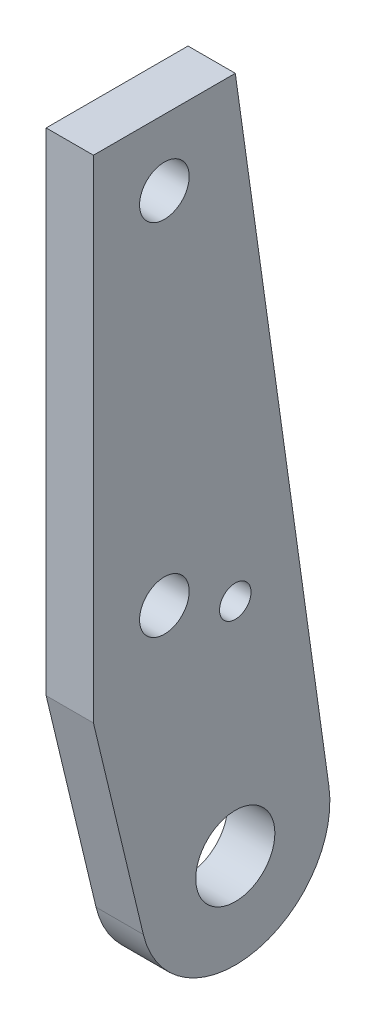
ISO-10303-21;
HEADER;
FILE_DESCRIPTION(('STEP AP214'),'2;1');
FILE_NAME('part.step','',(''),(''),'','','');
FILE_SCHEMA(('AUTOMOTIVE_DESIGN { 1 0 10303 214 1 1 1 1 }'));
ENDSEC;
DATA;
#1=APPLICATION_CONTEXT('core data for automotive mechanical design processes');
#2=APPLICATION_PROTOCOL_DEFINITION('international standard','automotive_design',2000,#1);
#3=PRODUCT_CONTEXT('',#1,'mechanical');
#4=PRODUCT('Part','Part','',(#3));
#5=PRODUCT_RELATED_PRODUCT_CATEGORY('part','',(#4));
#6=PRODUCT_DEFINITION_FORMATION('','',#4);
#7=PRODUCT_DEFINITION_CONTEXT('part definition',#1,'design');
#8=PRODUCT_DEFINITION('design','',#6,#7);
#9=PRODUCT_DEFINITION_SHAPE('','',#8);
#10=(LENGTH_UNIT() NAMED_UNIT(*) SI_UNIT(.MILLI.,.METRE.));
#11=(NAMED_UNIT(*) PLANE_ANGLE_UNIT() SI_UNIT($,.RADIAN.));
#12=(NAMED_UNIT(*) SI_UNIT($,.STERADIAN.) SOLID_ANGLE_UNIT());
#13=UNCERTAINTY_MEASURE_WITH_UNIT(LENGTH_MEASURE(1.E-05),#10,'distance_accuracy_value','');
#14=(GEOMETRIC_REPRESENTATION_CONTEXT(3) GLOBAL_UNCERTAINTY_ASSIGNED_CONTEXT((#13)) GLOBAL_UNIT_ASSIGNED_CONTEXT((#10,
#11,#12)) REPRESENTATION_CONTEXT('',''));
#15=CARTESIAN_POINT('',(0.,0.,0.));
#16=DIRECTION('',(0.,0.,1.));
#17=DIRECTION('',(1.,0.,0.));
#18=AXIS2_PLACEMENT_3D('',#15,#16,#17);
#19=CARTESIAN_POINT('',(52.7445119012656,-291545.,7.000000000005));
#20=DIRECTION('',(0.,0.,-1.));
#21=DIRECTION('',(0.,1.,0.));
#22=AXIS2_PLACEMENT_3D('',#19,#20,#21);
#23=PLANE('',#22);
#24=DIRECTION('',(0.,-1.,0.));
#25=VECTOR('',#24,1.);
#26=CARTESIAN_POINT('',(1.5,-291545.,7.000000000005));
#27=LINE('',#26,#25);
#28=CARTESIAN_POINT('',(1.5,24.4999999999891,7.000000000005));
#29=VERTEX_POINT('',#28);
#30=CARTESIAN_POINT('',(1.5,-6.69124999993187,6.99999999994105));
#31=VERTEX_POINT('',#30);
#32=EDGE_CURVE('E102',#29,#31,#27,.T.);
#33=ORIENTED_EDGE('',*,*,#32,.F.);
#34=DIRECTION('',(-1.,0.,0.));
#35=VECTOR('',#34,1.);
#36=CARTESIAN_POINT('',(52.7445119012656,24.4999999999891,7.000000000005));
#37=LINE('',#36,#35);
#38=CARTESIAN_POINT('',(-1.5,24.4999999999891,7.000000000005));
#39=VERTEX_POINT('',#38);
#40=EDGE_CURVE('E37',#29,#39,#37,.T.);
#41=ORIENTED_EDGE('',*,*,#40,.T.);
#42=DIRECTION('',(0.,-1.,0.));
#43=VECTOR('',#42,1.);
#44=CARTESIAN_POINT('',(-1.5,-291545.,7.000000000005));
#45=LINE('',#44,#43);
#46=CARTESIAN_POINT('',(-1.5,-6.69124999993187,6.99999999994105));
#47=VERTEX_POINT('',#46);
#48=EDGE_CURVE('E112',#39,#47,#45,.T.);
#49=ORIENTED_EDGE('',*,*,#48,.T.);
#50=DIRECTION('',(-1.,0.,0.));
#51=VECTOR('',#50,1.);
#52=CARTESIAN_POINT('',(52.7445119012656,-6.69124999993187,6.99999999994105));
#53=LINE('',#52,#51);
#54=EDGE_CURVE('E76',#31,#47,#53,.T.);
#55=ORIENTED_EDGE('',*,*,#54,.F.);
#56=EDGE_LOOP('',(#33,#41,#49,#55));
#57=FACE_BOUND('',#56,.T.);
#58=ADVANCED_FACE('F33',(#57),#23,.F.);
#59=CARTESIAN_POINT('',(52.7445119012656,-185053.778356643,-44341.5232351401));
#60=DIRECTION('',(0.,0.233060998221894,-0.972462118083689));
#61=DIRECTION('',(0.,0.972462118083689,0.233060998221894));
#62=AXIS2_PLACEMENT_3D('',#59,#60,#61);
#63=PLANE('',#62);
#64=DIRECTION('',(0.,-0.972462118083689,-0.233060998221894));
#65=VECTOR('',#64,1.);
#66=CARTESIAN_POINT('',(1.5,-185053.778356643,-44341.5232351401));
#67=LINE('',#66,#65);
#68=CARTESIAN_POINT('',(1.5,-19.8983659892544,3.83477270852562));
#69=VERTEX_POINT('',#68);
#70=EDGE_CURVE('E83',#31,#69,#67,.T.);
#71=ORIENTED_EDGE('',*,*,#70,.F.);
#72=ORIENTED_EDGE('',*,*,#54,.T.);
#73=DIRECTION('',(0.,-0.972462118083689,-0.233060998221894));
#74=VECTOR('',#73,1.);
#75=CARTESIAN_POINT('',(-1.5,-185053.778356643,-44341.5232351401));
#76=LINE('',#75,#74);
#77=CARTESIAN_POINT('',(-1.5,-19.8983659892544,3.83477270852562));
#78=VERTEX_POINT('',#77);
#79=EDGE_CURVE('E111',#47,#78,#76,.T.);
#80=ORIENTED_EDGE('',*,*,#79,.T.);
#81=DIRECTION('',(-1.,0.,0.));
#82=VECTOR('',#81,1.);
#83=CARTESIAN_POINT('',(52.7445119012656,-19.8983659892544,3.83477270852562));
#84=LINE('',#83,#82);
#85=EDGE_CURVE('E113',#69,#78,#84,.T.);
#86=ORIENTED_EDGE('',*,*,#85,.F.);
#87=EDGE_LOOP('',(#71,#72,#80,#86));
#88=FACE_BOUND('',#87,.T.);
#89=ADVANCED_FACE('F174',(#88),#63,.F.);
#90=CARTESIAN_POINT('',(52.7445119012656,-18.4999999999995,-1.99999999999534));
#91=DIRECTION('',(-1.,0.,0.));
#92=DIRECTION('',(0.,0.,1.));
#93=AXIS2_PLACEMENT_3D('',#90,#91,#92);
#94=CYLINDRICAL_SURFACE('',#93,6.00000000000048);
#95=CARTESIAN_POINT('',(1.5,-18.4999999999995,-1.99999999999534));
#96=DIRECTION('',(1.,0.,0.));
#97=DIRECTION('',(0.,0.,-1.));
#98=AXIS2_PLACEMENT_3D('',#95,#96,#97);
#99=CIRCLE('',#98,6.00000000000048);
#100=CARTESIAN_POINT('',(1.5,-17.6627906976705,-7.94130293652273));
#101=VERTEX_POINT('',#100);
#102=EDGE_CURVE('E42',#69,#101,#99,.T.);
#103=ORIENTED_EDGE('',*,*,#102,.F.);
#104=ORIENTED_EDGE('',*,*,#85,.T.);
#105=CARTESIAN_POINT('',(-1.5,-18.4999999999995,-1.99999999999534));
#106=DIRECTION('',(1.,0.,0.));
#107=DIRECTION('',(0.,0.,-1.));
#108=AXIS2_PLACEMENT_3D('',#105,#106,#107);
#109=CIRCLE('',#108,6.00000000000048);
#110=CARTESIAN_POINT('',(-1.5,-17.6627906976705,-7.94130293652273));
#111=VERTEX_POINT('',#110);
#112=EDGE_CURVE('E96',#78,#111,#109,.T.);
#113=ORIENTED_EDGE('',*,*,#112,.T.);
#114=DIRECTION('',(-1.,0.,0.));
#115=VECTOR('',#114,1.);
#116=CARTESIAN_POINT('',(52.7445119012656,-17.6627906976705,-7.94130293652273));
#117=LINE('',#116,#115);
#118=EDGE_CURVE('E88',#101,#111,#117,.T.);
#119=ORIENTED_EDGE('',*,*,#118,.F.);
#120=EDGE_LOOP('',(#103,#104,#113,#119));
#121=FACE_BOUND('',#120,.T.);
#122=ADVANCED_FACE('F94',(#121),#94,.T.);
#123=CARTESIAN_POINT('',(52.7445119012656,-230599.935932356,-32500.0774701305));
#124=DIRECTION('',(0.,-0.139534883720944,0.990217156095057));
#125=DIRECTION('',(0.,-0.990217156095057,-0.139534883720944));
#126=AXIS2_PLACEMENT_3D('',#123,#124,#125);
#127=PLANE('',#126);
#128=DIRECTION('',(0.,0.990217156095057,0.139534883720944));
#129=VECTOR('',#128,1.);
#130=CARTESIAN_POINT('',(1.5,-230599.935932356,-32500.0774701305));
#131=LINE('',#130,#129);
#132=CARTESIAN_POINT('',(1.5,24.4999999999891,-1.99999999995271));
#133=VERTEX_POINT('',#132);
#134=EDGE_CURVE('E11',#101,#133,#131,.T.);
#135=ORIENTED_EDGE('',*,*,#134,.F.);
#136=ORIENTED_EDGE('',*,*,#118,.T.);
#137=DIRECTION('',(0.,0.990217156095057,0.139534883720944));
#138=VECTOR('',#137,1.);
#139=CARTESIAN_POINT('',(-1.5,-230599.935932356,-32500.0774701305));
#140=LINE('',#139,#138);
#141=CARTESIAN_POINT('',(-1.5,24.4999999999891,-1.99999999995271));
#142=VERTEX_POINT('',#141);
#143=EDGE_CURVE('E98',#111,#142,#140,.T.);
#144=ORIENTED_EDGE('',*,*,#143,.T.);
#145=DIRECTION('',(-1.,0.,0.));
#146=VECTOR('',#145,1.);
#147=CARTESIAN_POINT('',(52.7445119012656,24.4999999999891,-1.99999999995271));
#148=LINE('',#147,#146);
#149=EDGE_CURVE('E55',#133,#142,#148,.T.);
#150=ORIENTED_EDGE('',*,*,#149,.F.);
#151=EDGE_LOOP('',(#135,#136,#144,#150));
#152=FACE_BOUND('',#151,.T.);
#153=ADVANCED_FACE('F87',(#152),#127,.F.);
#154=CARTESIAN_POINT('',(52.7445119012656,24.4999999999891,400000.));
#155=DIRECTION('',(0.,-1.,0.));
#156=DIRECTION('',(0.,0.,-1.));
#157=AXIS2_PLACEMENT_3D('',#154,#155,#156);
#158=PLANE('',#157);
#159=DIRECTION('',(0.,0.,1.));
#160=VECTOR('',#159,1.);
#161=CARTESIAN_POINT('',(1.5,24.4999999999891,400000.));
#162=LINE('',#161,#160);
#163=EDGE_CURVE('E107',#133,#29,#162,.T.);
#164=ORIENTED_EDGE('',*,*,#163,.F.);
#165=ORIENTED_EDGE('',*,*,#149,.T.);
#166=DIRECTION('',(0.,0.,1.));
#167=VECTOR('',#166,1.);
#168=CARTESIAN_POINT('',(-1.5,24.4999999999891,400000.));
#169=LINE('',#168,#167);
#170=EDGE_CURVE('E109',#142,#39,#169,.T.);
#171=ORIENTED_EDGE('',*,*,#170,.T.);
#172=ORIENTED_EDGE('',*,*,#40,.F.);
#173=EDGE_LOOP('',(#164,#165,#171,#172));
#174=FACE_BOUND('',#173,.T.);
#175=ADVANCED_FACE('F184',(#174),#158,.F.);
#176=CARTESIAN_POINT('',(-1.5,-18.4999999999995,-1.99999999999534));
#177=DIRECTION('',(1.,0.,0.));
#178=DIRECTION('',(0.,0.,-1.));
#179=AXIS2_PLACEMENT_3D('',#176,#177,#178);
#180=PLANE('',#179);
#181=CARTESIAN_POINT('',(-1.5,-4.49999999999952,-1.99999999999534));
#182=DIRECTION('',(1.,0.,0.));
#183=DIRECTION('',(0.,0.,-1.));
#184=AXIS2_PLACEMENT_3D('',#181,#182,#183);
#185=CIRCLE('',#184,1.);
#186=CARTESIAN_POINT('',(-1.5,-4.49999999999952,-2.99999999999534));
#187=VERTEX_POINT('',#186);
#188=EDGE_CURVE('E139',#187,#187,#185,.T.);
#189=ORIENTED_EDGE('',*,*,#188,.T.);
#190=EDGE_LOOP('',(#189));
#191=FACE_BOUND('',#190,.T.);
#192=CARTESIAN_POINT('',(-1.5,20.2999999999989,2.50000000000467));
#193=DIRECTION('',(1.,0.,0.));
#194=DIRECTION('',(0.,0.,-1.));
#195=AXIS2_PLACEMENT_3D('',#192,#193,#194);
#196=CIRCLE('',#195,1.575);
#197=CARTESIAN_POINT('',(-1.5,20.2999999999989,0.925000000004665));
#198=VERTEX_POINT('',#197);
#199=EDGE_CURVE('E135',#198,#198,#196,.T.);
#200=ORIENTED_EDGE('',*,*,#199,.T.);
#201=EDGE_LOOP('',(#200));
#202=FACE_BOUND('',#201,.T.);
#203=CARTESIAN_POINT('',(-1.5,-2.4912499999985,2.50000000000467));
#204=DIRECTION('',(1.,0.,0.));
#205=DIRECTION('',(0.,0.,-1.));
#206=AXIS2_PLACEMENT_3D('',#203,#204,#205);
#207=CIRCLE('',#206,1.575);
#208=CARTESIAN_POINT('',(-1.5,-2.4912499999985,0.925000000004665));
#209=VERTEX_POINT('',#208);
#210=EDGE_CURVE('E136',#209,#209,#207,.T.);
#211=ORIENTED_EDGE('',*,*,#210,.T.);
#212=EDGE_LOOP('',(#211));
#213=FACE_BOUND('',#212,.T.);
#214=CARTESIAN_POINT('',(-1.5,-18.4999999999995,-1.99999999999534));
#215=DIRECTION('',(1.,0.,0.));
#216=DIRECTION('',(0.,0.,-1.));
#217=AXIS2_PLACEMENT_3D('',#214,#215,#216);
#218=CIRCLE('',#217,2.51);
#219=CARTESIAN_POINT('',(-1.5,-18.4999999999995,-4.50999999999534));
#220=VERTEX_POINT('',#219);
#221=EDGE_CURVE('E123',#220,#220,#218,.T.);
#222=ORIENTED_EDGE('',*,*,#221,.T.);
#223=EDGE_LOOP('',(#222));
#224=FACE_BOUND('',#223,.T.);
#225=ORIENTED_EDGE('',*,*,#48,.F.);
#226=ORIENTED_EDGE('',*,*,#170,.F.);
#227=ORIENTED_EDGE('',*,*,#143,.F.);
#228=ORIENTED_EDGE('',*,*,#112,.F.);
#229=ORIENTED_EDGE('',*,*,#79,.F.);
#230=EDGE_LOOP('',(#225,#226,#227,#228,#229));
#231=FACE_BOUND('',#230,.T.);
#232=ADVANCED_FACE('F155',(#191,#202,#213,#224,#231),#180,.F.);
#233=CARTESIAN_POINT('',(1.5,0.,0.));
#234=DIRECTION('',(1.,0.,0.));
#235=DIRECTION('',(0.,0.,-1.));
#236=AXIS2_PLACEMENT_3D('',#233,#234,#235);
#237=PLANE('',#236);
#238=CARTESIAN_POINT('',(1.5,-4.49999999999952,-1.99999999999534));
#239=DIRECTION('',(1.,0.,0.));
#240=DIRECTION('',(0.,0.,-1.));
#241=AXIS2_PLACEMENT_3D('',#238,#239,#240);
#242=CIRCLE('',#241,1.);
#243=CARTESIAN_POINT('',(1.5,-4.49999999999952,-2.99999999999534));
#244=VERTEX_POINT('',#243);
#245=EDGE_CURVE('E146',#244,#244,#242,.T.);
#246=ORIENTED_EDGE('',*,*,#245,.F.);
#247=EDGE_LOOP('',(#246));
#248=FACE_BOUND('',#247,.T.);
#249=CARTESIAN_POINT('',(1.5,20.2999999999989,2.50000000000467));
#250=DIRECTION('',(1.,0.,0.));
#251=DIRECTION('',(0.,0.,-1.));
#252=AXIS2_PLACEMENT_3D('',#249,#250,#251);
#253=CIRCLE('',#252,1.575);
#254=CARTESIAN_POINT('',(1.5,20.2999999999989,0.925000000004665));
#255=VERTEX_POINT('',#254);
#256=EDGE_CURVE('E129',#255,#255,#253,.T.);
#257=ORIENTED_EDGE('',*,*,#256,.F.);
#258=EDGE_LOOP('',(#257));
#259=FACE_BOUND('',#258,.T.);
#260=CARTESIAN_POINT('',(1.5,-2.4912499999985,2.50000000000467));
#261=DIRECTION('',(1.,0.,0.));
#262=DIRECTION('',(0.,0.,-1.));
#263=AXIS2_PLACEMENT_3D('',#260,#261,#262);
#264=CIRCLE('',#263,1.575);
#265=CARTESIAN_POINT('',(1.5,-2.4912499999985,0.925000000004665));
#266=VERTEX_POINT('',#265);
#267=EDGE_CURVE('E132',#266,#266,#264,.T.);
#268=ORIENTED_EDGE('',*,*,#267,.F.);
#269=EDGE_LOOP('',(#268));
#270=FACE_BOUND('',#269,.T.);
#271=CARTESIAN_POINT('',(1.5,-18.4999999999995,-1.99999999999534));
#272=DIRECTION('',(1.,0.,0.));
#273=DIRECTION('',(0.,0.,-1.));
#274=AXIS2_PLACEMENT_3D('',#271,#272,#273);
#275=CIRCLE('',#274,2.51);
#276=CARTESIAN_POINT('',(1.5,-18.4999999999995,-4.50999999999534));
#277=VERTEX_POINT('',#276);
#278=EDGE_CURVE('E125',#277,#277,#275,.T.);
#279=ORIENTED_EDGE('',*,*,#278,.F.);
#280=EDGE_LOOP('',(#279));
#281=FACE_BOUND('',#280,.T.);
#282=ORIENTED_EDGE('',*,*,#163,.T.);
#283=ORIENTED_EDGE('',*,*,#32,.T.);
#284=ORIENTED_EDGE('',*,*,#70,.T.);
#285=ORIENTED_EDGE('',*,*,#102,.T.);
#286=ORIENTED_EDGE('',*,*,#134,.T.);
#287=EDGE_LOOP('',(#282,#283,#284,#285,#286));
#288=FACE_BOUND('',#287,.T.);
#289=ADVANCED_FACE('F35',(#248,#259,#270,#281,#288),#237,.T.);
#290=CARTESIAN_POINT('',(-1.5,-18.4999999999995,-1.99999999999534));
#291=DIRECTION('',(1.,0.,0.));
#292=DIRECTION('',(0.,0.,-1.));
#293=AXIS2_PLACEMENT_3D('',#290,#291,#292);
#294=CYLINDRICAL_SURFACE('',#293,2.51);
#295=ORIENTED_EDGE('',*,*,#221,.F.);
#296=EDGE_LOOP('',(#295));
#297=FACE_BOUND('',#296,.T.);
#298=ORIENTED_EDGE('',*,*,#278,.T.);
#299=EDGE_LOOP('',(#298));
#300=FACE_BOUND('',#299,.T.);
#301=ADVANCED_FACE('F154',(#297,#300),#294,.F.);
#302=CARTESIAN_POINT('',(-1.5,-2.4912499999985,2.50000000000467));
#303=DIRECTION('',(1.,0.,0.));
#304=DIRECTION('',(0.,0.,-1.));
#305=AXIS2_PLACEMENT_3D('',#302,#303,#304);
#306=CYLINDRICAL_SURFACE('',#305,1.575);
#307=ORIENTED_EDGE('',*,*,#210,.F.);
#308=EDGE_LOOP('',(#307));
#309=FACE_BOUND('',#308,.T.);
#310=ORIENTED_EDGE('',*,*,#267,.T.);
#311=EDGE_LOOP('',(#310));
#312=FACE_BOUND('',#311,.T.);
#313=ADVANCED_FACE('F163',(#309,#312),#306,.F.);
#314=CARTESIAN_POINT('',(-1.5,20.2999999999989,2.50000000000467));
#315=DIRECTION('',(1.,0.,0.));
#316=DIRECTION('',(0.,0.,-1.));
#317=AXIS2_PLACEMENT_3D('',#314,#315,#316);
#318=CYLINDRICAL_SURFACE('',#317,1.575);
#319=ORIENTED_EDGE('',*,*,#199,.F.);
#320=EDGE_LOOP('',(#319));
#321=FACE_BOUND('',#320,.T.);
#322=ORIENTED_EDGE('',*,*,#256,.T.);
#323=EDGE_LOOP('',(#322));
#324=FACE_BOUND('',#323,.T.);
#325=ADVANCED_FACE('F169',(#321,#324),#318,.F.);
#326=CARTESIAN_POINT('',(-1.5,-4.49999999999952,-1.99999999999534));
#327=DIRECTION('',(1.,0.,0.));
#328=DIRECTION('',(0.,0.,-1.));
#329=AXIS2_PLACEMENT_3D('',#326,#327,#328);
#330=CYLINDRICAL_SURFACE('',#329,1.);
#331=ORIENTED_EDGE('',*,*,#188,.F.);
#332=EDGE_LOOP('',(#331));
#333=FACE_BOUND('',#332,.T.);
#334=ORIENTED_EDGE('',*,*,#245,.T.);
#335=EDGE_LOOP('',(#334));
#336=FACE_BOUND('',#335,.T.);
#337=ADVANCED_FACE('F150',(#333,#336),#330,.F.);
#338=CLOSED_SHELL('',(#58,#89,#122,#153,#175,#232,#289,#301,#313,#325,#337));
#339=MANIFOLD_SOLID_BREP('B2',#338);
#340=ADVANCED_BREP_SHAPE_REPRESENTATION('',(#18,#339),#14);
#341=SHAPE_DEFINITION_REPRESENTATION(#9,#340);
ENDSEC;
END-ISO-10303-21;
